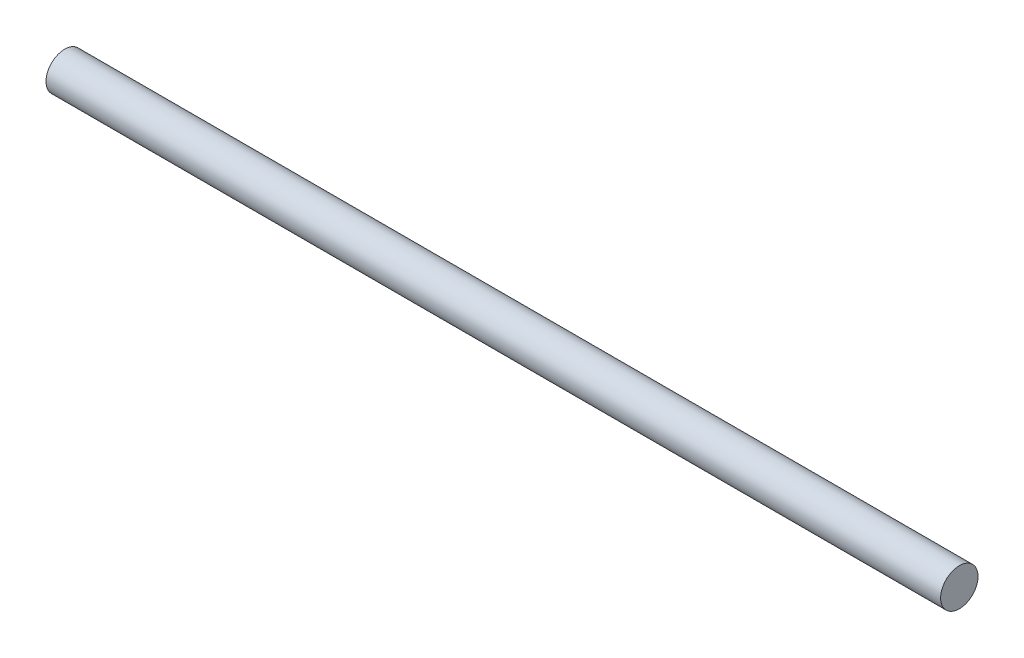
ISO-10303-21;
HEADER;
FILE_DESCRIPTION(('STEP AP214'),'2;1');
FILE_NAME('part.step','',(''),(''),'','','');
FILE_SCHEMA(('AUTOMOTIVE_DESIGN { 1 0 10303 214 1 1 1 1 }'));
ENDSEC;
DATA;
#1=APPLICATION_CONTEXT('core data for automotive mechanical design processes');
#2=APPLICATION_PROTOCOL_DEFINITION('international standard','automotive_design',2000,#1);
#3=PRODUCT_CONTEXT('',#1,'mechanical');
#4=PRODUCT('Part','Part','',(#3));
#5=PRODUCT_RELATED_PRODUCT_CATEGORY('part','',(#4));
#6=PRODUCT_DEFINITION_FORMATION('','',#4);
#7=PRODUCT_DEFINITION_CONTEXT('part definition',#1,'design');
#8=PRODUCT_DEFINITION('design','',#6,#7);
#9=PRODUCT_DEFINITION_SHAPE('','',#8);
#10=(LENGTH_UNIT() NAMED_UNIT(*) SI_UNIT(.MILLI.,.METRE.));
#11=(NAMED_UNIT(*) PLANE_ANGLE_UNIT() SI_UNIT($,.RADIAN.));
#12=(NAMED_UNIT(*) SI_UNIT($,.STERADIAN.) SOLID_ANGLE_UNIT());
#13=UNCERTAINTY_MEASURE_WITH_UNIT(LENGTH_MEASURE(1.E-05),#10,'distance_accuracy_value','');
#14=(GEOMETRIC_REPRESENTATION_CONTEXT(3) GLOBAL_UNCERTAINTY_ASSIGNED_CONTEXT((#13)) GLOBAL_UNIT_ASSIGNED_CONTEXT((#10,
#11,#12)) REPRESENTATION_CONTEXT('',''));
#15=CARTESIAN_POINT('',(0.,0.,0.));
#16=DIRECTION('',(0.,0.,1.));
#17=DIRECTION('',(1.,0.,0.));
#18=AXIS2_PLACEMENT_3D('',#15,#16,#17);
#19=CARTESIAN_POINT('',(60.7441,0.,0.));
#20=DIRECTION('',(-1.,0.,0.));
#21=DIRECTION('',(0.,0.,1.));
#22=AXIS2_PLACEMENT_3D('',#19,#20,#21);
#23=CYLINDRICAL_SURFACE('',#22,1.27);
#24=CARTESIAN_POINT('',(60.7441,0.,0.));
#25=DIRECTION('',(1.,0.,0.));
#26=DIRECTION('',(0.,0.,-1.));
#27=AXIS2_PLACEMENT_3D('',#24,#25,#26);
#28=CIRCLE('',#27,1.27);
#29=CARTESIAN_POINT('',(60.7441,0.,1.27));
#30=VERTEX_POINT('',#29);
#31=EDGE_CURVE('E10',#30,#30,#28,.T.);
#32=CARTESIAN_POINT('',(0.,0.,0.));
#33=DIRECTION('',(1.,0.,0.));
#34=DIRECTION('',(0.,0.,-1.));
#35=AXIS2_PLACEMENT_3D('',#32,#33,#34);
#36=CIRCLE('',#35,1.27);
#37=CARTESIAN_POINT('',(0.,0.,1.27));
#38=VERTEX_POINT('',#37);
#39=EDGE_CURVE('E48',#38,#38,#36,.T.);
#40=CARTESIAN_POINT('',(60.7441,0.,1.27));
#41=CARTESIAN_POINT('',(60.1113489583333,0.,1.27));
#42=CARTESIAN_POINT('',(59.4785979166667,0.,1.27));
#43=CARTESIAN_POINT('',(58.2130958333333,0.,1.27));
#44=CARTESIAN_POINT('',(57.5803447916667,0.,1.27));
#45=CARTESIAN_POINT('',(56.3148427083333,0.,1.27));
#46=CARTESIAN_POINT('',(55.6820916666667,0.,1.27));
#47=CARTESIAN_POINT('',(54.4165895833333,0.,1.27));
#48=CARTESIAN_POINT('',(53.7838385416667,0.,1.27));
#49=CARTESIAN_POINT('',(52.5183364583333,0.,1.27));
#50=CARTESIAN_POINT('',(51.8855854166667,0.,1.27));
#51=CARTESIAN_POINT('',(50.6200833333333,0.,1.27));
#52=CARTESIAN_POINT('',(49.9873322916667,0.,1.27));
#53=CARTESIAN_POINT('',(48.7218302083333,0.,1.27));
#54=CARTESIAN_POINT('',(48.0890791666667,0.,1.27));
#55=CARTESIAN_POINT('',(46.8235770833333,0.,1.27));
#56=CARTESIAN_POINT('',(46.1908260416667,0.,1.27));
#57=CARTESIAN_POINT('',(44.9253239583333,0.,1.27));
#58=CARTESIAN_POINT('',(44.2925729166667,0.,1.27));
#59=CARTESIAN_POINT('',(43.0270708333333,0.,1.27));
#60=CARTESIAN_POINT('',(42.3943197916667,0.,1.27));
#61=CARTESIAN_POINT('',(41.1288177083333,0.,1.27));
#62=CARTESIAN_POINT('',(40.4960666666667,0.,1.27));
#63=CARTESIAN_POINT('',(39.2305645833333,0.,1.27));
#64=CARTESIAN_POINT('',(38.5978135416667,0.,1.27));
#65=CARTESIAN_POINT('',(37.3323114583333,0.,1.27));
#66=CARTESIAN_POINT('',(36.6995604166667,0.,1.27));
#67=CARTESIAN_POINT('',(35.4340583333333,0.,1.27));
#68=CARTESIAN_POINT('',(34.8013072916667,0.,1.27));
#69=CARTESIAN_POINT('',(33.5358052083333,0.,1.27));
#70=CARTESIAN_POINT('',(32.9030541666667,0.,1.27));
#71=CARTESIAN_POINT('',(31.6375520833333,0.,1.27));
#72=CARTESIAN_POINT('',(31.0048010416667,0.,1.27));
#73=CARTESIAN_POINT('',(29.7392989583333,0.,1.27));
#74=CARTESIAN_POINT('',(29.1065479166667,0.,1.27));
#75=CARTESIAN_POINT('',(27.8410458333333,0.,1.27));
#76=CARTESIAN_POINT('',(27.2082947916667,0.,1.27));
#77=CARTESIAN_POINT('',(25.9427927083333,0.,1.27));
#78=CARTESIAN_POINT('',(25.3100416666667,0.,1.27));
#79=CARTESIAN_POINT('',(24.0445395833333,0.,1.27));
#80=CARTESIAN_POINT('',(23.4117885416667,0.,1.27));
#81=CARTESIAN_POINT('',(22.1462864583333,0.,1.27));
#82=CARTESIAN_POINT('',(21.5135354166667,0.,1.27));
#83=CARTESIAN_POINT('',(20.2480333333333,0.,1.27));
#84=CARTESIAN_POINT('',(19.6152822916667,0.,1.27));
#85=CARTESIAN_POINT('',(18.3497802083333,0.,1.27));
#86=CARTESIAN_POINT('',(17.7170291666667,0.,1.27));
#87=CARTESIAN_POINT('',(16.4515270833333,0.,1.27));
#88=CARTESIAN_POINT('',(15.8187760416667,0.,1.27));
#89=CARTESIAN_POINT('',(14.5532739583333,0.,1.27));
#90=CARTESIAN_POINT('',(13.9205229166667,0.,1.27));
#91=CARTESIAN_POINT('',(12.6550208333333,0.,1.27));
#92=CARTESIAN_POINT('',(12.0222697916667,0.,1.27));
#93=CARTESIAN_POINT('',(10.7567677083333,0.,1.27));
#94=CARTESIAN_POINT('',(10.1240166666667,0.,1.27));
#95=CARTESIAN_POINT('',(8.85851458333334,0.,1.27));
#96=CARTESIAN_POINT('',(8.22576354166667,0.,1.27));
#97=CARTESIAN_POINT('',(6.96026145833333,0.,1.27));
#98=CARTESIAN_POINT('',(6.32751041666667,0.,1.27));
#99=CARTESIAN_POINT('',(5.06200833333333,0.,1.27));
#100=CARTESIAN_POINT('',(4.42925729166666,0.,1.27));
#101=CARTESIAN_POINT('',(3.16375520833333,0.,1.27));
#102=CARTESIAN_POINT('',(2.53100416666667,0.,1.27));
#103=CARTESIAN_POINT('',(1.26550208333333,0.,1.27));
#104=CARTESIAN_POINT('',(0.632751041666666,0.,1.27));
#105=CARTESIAN_POINT('',(0.,0.,1.27));
#106=B_SPLINE_CURVE_WITH_KNOTS('',3,(#40,#41,#42,#43,#44,#45,#46,#47,#48,#49,#50,#51,#52,#53,
#54,#55,#56,#57,#58,#59,#60,#61,#62,#63,#64,#65,#66,#67,#68,#69,#70,#71,#72,#73,#74,#75,#76,#77,
#78,#79,#80,#81,#82,#83,#84,#85,#86,#87,#88,#89,#90,#91,#92,#93,#94,#95,#96,#97,#98,#99,#100,
#101,#102,#103,#104,#105),.UNSPECIFIED.,.F.,.F.,(4,2,2,2,2,2,2,2,2,2,2,2,2,2,2,2,2,2,2,2,2,2,2,
2,2,2,2,2,2,2,2,2,4),(0.,1.898253125,3.79650625,5.694759375,7.5930125,9.491265625,11.38951875,
13.287771875,15.186025,17.084278125,18.98253125,20.880784375,22.7790375,24.677290625,
26.57554375,28.473796875,30.37205,32.270303125,34.16855625,36.066809375,37.9650625,39.863315625,
41.76156875,43.659821875,45.558075,47.456328125,49.35458125,51.252834375,53.1510875,
55.049340625,56.94759375,58.845846875,60.7441),.UNSPECIFIED.);
#107=EDGE_CURVE('BSEAM44',#30,#38,#106,.T.);
#108=ORIENTED_EDGE('',*,*,#31,.F.);
#109=ORIENTED_EDGE('',*,*,#39,.T.);
#110=ORIENTED_EDGE('',*,*,#107,.T.);
#111=ORIENTED_EDGE('',*,*,#107,.F.);
#112=EDGE_LOOP('',(#108,#110,#109,#111));
#113=FACE_BOUND('',#112,.T.);
#114=ADVANCED_FACE('F44',(#113),#23,.T.);
#115=CARTESIAN_POINT('',(60.7441,0.,0.));
#116=DIRECTION('',(1.,0.,0.));
#117=DIRECTION('',(0.,0.,-1.));
#118=AXIS2_PLACEMENT_3D('',#115,#116,#117);
#119=PLANE('',#118);
#120=ORIENTED_EDGE('',*,*,#31,.T.);
#121=EDGE_LOOP('',(#120));
#122=FACE_BOUND('',#121,.T.);
#123=ADVANCED_FACE('F58',(#122),#119,.T.);
#124=CARTESIAN_POINT('',(0.,0.,0.));
#125=DIRECTION('',(1.,0.,0.));
#126=DIRECTION('',(0.,0.,-1.));
#127=AXIS2_PLACEMENT_3D('',#124,#125,#126);
#128=PLANE('',#127);
#129=ORIENTED_EDGE('',*,*,#39,.F.);
#130=EDGE_LOOP('',(#129));
#131=FACE_BOUND('',#130,.T.);
#132=ADVANCED_FACE('F59',(#131),#128,.F.);
#133=CLOSED_SHELL('',(#114,#123,#132));
#134=MANIFOLD_SOLID_BREP('B2',#133);
#135=ADVANCED_BREP_SHAPE_REPRESENTATION('',(#18,#134),#14);
#136=SHAPE_DEFINITION_REPRESENTATION(#9,#135);
ENDSEC;
END-ISO-10303-21;
